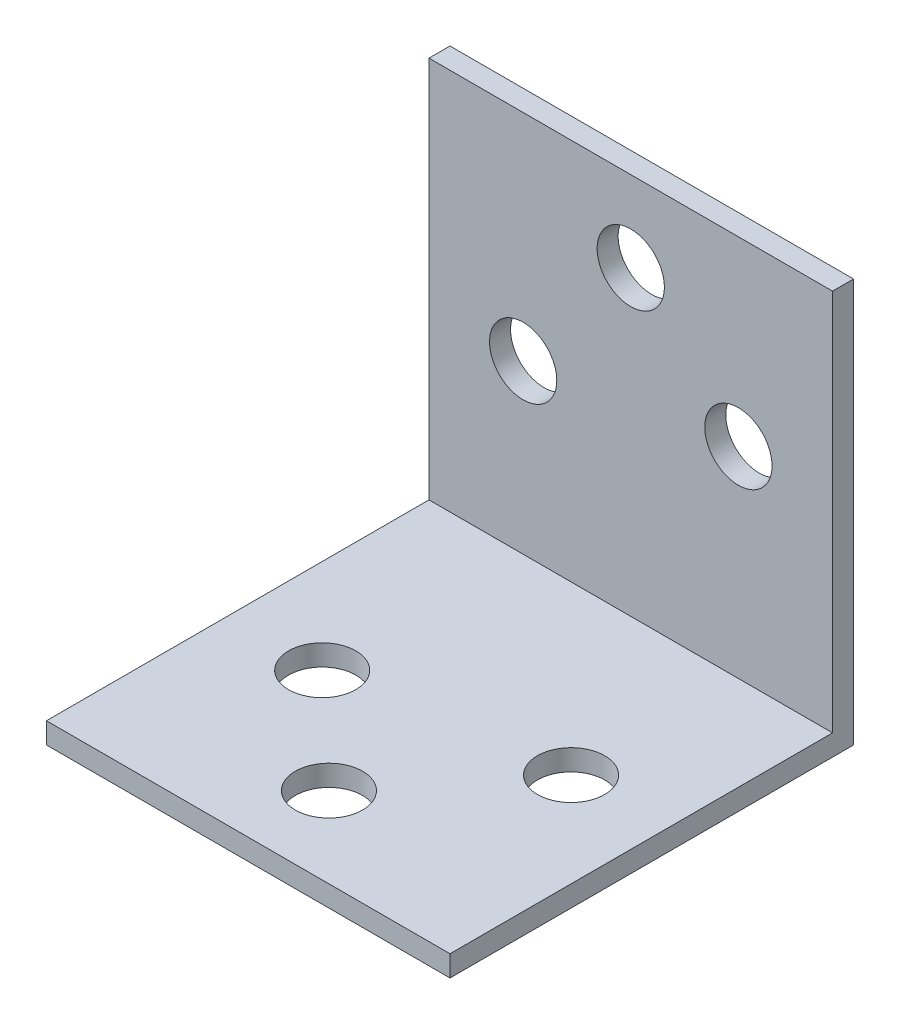
ISO-10303-21;
HEADER;
FILE_DESCRIPTION(('STEP AP214'),'2;1');
FILE_NAME('part.step','',(''),(''),'','','');
FILE_SCHEMA(('AUTOMOTIVE_DESIGN { 1 0 10303 214 1 1 1 1 }'));
ENDSEC;
DATA;
#1=APPLICATION_CONTEXT('core data for automotive mechanical design processes');
#2=APPLICATION_PROTOCOL_DEFINITION('international standard','automotive_design',2000,#1);
#3=PRODUCT_CONTEXT('',#1,'mechanical');
#4=PRODUCT('Part','Part','',(#3));
#5=PRODUCT_RELATED_PRODUCT_CATEGORY('part','',(#4));
#6=PRODUCT_DEFINITION_FORMATION('','',#4);
#7=PRODUCT_DEFINITION_CONTEXT('part definition',#1,'design');
#8=PRODUCT_DEFINITION('design','',#6,#7);
#9=PRODUCT_DEFINITION_SHAPE('','',#8);
#10=(LENGTH_UNIT() NAMED_UNIT(*) SI_UNIT(.MILLI.,.METRE.));
#11=(NAMED_UNIT(*) PLANE_ANGLE_UNIT() SI_UNIT($,.RADIAN.));
#12=(NAMED_UNIT(*) SI_UNIT($,.STERADIAN.) SOLID_ANGLE_UNIT());
#13=UNCERTAINTY_MEASURE_WITH_UNIT(LENGTH_MEASURE(1.E-05),#10,'distance_accuracy_value','');
#14=(GEOMETRIC_REPRESENTATION_CONTEXT(3) GLOBAL_UNCERTAINTY_ASSIGNED_CONTEXT((#13)) GLOBAL_UNIT_ASSIGNED_CONTEXT((#10,
#11,#12)) REPRESENTATION_CONTEXT('',''));
#15=CARTESIAN_POINT('',(0.,0.,0.));
#16=DIRECTION('',(0.,0.,1.));
#17=DIRECTION('',(1.,0.,0.));
#18=AXIS2_PLACEMENT_3D('',#15,#16,#17);
#19=CARTESIAN_POINT('',(0.,1.984375,0.));
#20=DIRECTION('',(0.,-1.,0.));
#21=DIRECTION('',(0.,0.,-1.));
#22=AXIS2_PLACEMENT_3D('',#19,#20,#21);
#23=PLANE('',#22);
#24=CARTESIAN_POINT('',(29.21,1.984375,17.78));
#25=DIRECTION('',(0.,1.,0.));
#26=DIRECTION('',(0.,0.,1.));
#27=AXIS2_PLACEMENT_3D('',#24,#25,#26);
#28=CIRCLE('',#27,3.175);
#29=CARTESIAN_POINT('',(29.21,1.984375,20.955));
#30=VERTEX_POINT('',#29);
#31=EDGE_CURVE('E169',#30,#30,#28,.T.);
#32=ORIENTED_EDGE('',*,*,#31,.F.);
#33=EDGE_LOOP('',(#32));
#34=FACE_BOUND('',#33,.T.);
#35=CARTESIAN_POINT('',(19.05,1.984375,30.48));
#36=DIRECTION('',(0.,1.,0.));
#37=DIRECTION('',(0.,0.,1.));
#38=AXIS2_PLACEMENT_3D('',#35,#36,#37);
#39=CIRCLE('',#38,3.175);
#40=CARTESIAN_POINT('',(19.05,1.984375,33.655));
#41=VERTEX_POINT('',#40);
#42=EDGE_CURVE('E177',#41,#41,#39,.T.);
#43=ORIENTED_EDGE('',*,*,#42,.F.);
#44=EDGE_LOOP('',(#43));
#45=FACE_BOUND('',#44,.T.);
#46=CARTESIAN_POINT('',(8.89,1.984375,20.955));
#47=DIRECTION('',(0.,1.,0.));
#48=DIRECTION('',(0.,0.,1.));
#49=AXIS2_PLACEMENT_3D('',#46,#47,#48);
#50=CIRCLE('',#49,3.175);
#51=CARTESIAN_POINT('',(8.89,1.984375,24.13));
#52=VERTEX_POINT('',#51);
#53=EDGE_CURVE('E117',#52,#52,#50,.T.);
#54=ORIENTED_EDGE('',*,*,#53,.F.);
#55=EDGE_LOOP('',(#54));
#56=FACE_BOUND('',#55,.T.);
#57=DIRECTION('',(1.,0.,0.));
#58=VECTOR('',#57,1.);
#59=CARTESIAN_POINT('',(38.1,1.984375,1.984375));
#60=LINE('',#59,#58);
#61=CARTESIAN_POINT('',(0.,1.984375,1.98437500000002));
#62=VERTEX_POINT('',#61);
#63=CARTESIAN_POINT('',(38.1,1.984375,1.984375));
#64=VERTEX_POINT('',#63);
#65=EDGE_CURVE('E59',#62,#64,#60,.T.);
#66=ORIENTED_EDGE('',*,*,#65,.F.);
#67=DIRECTION('',(0.,0.,1.));
#68=VECTOR('',#67,1.);
#69=CARTESIAN_POINT('',(0.,1.984375,38.1));
#70=LINE('',#69,#68);
#71=CARTESIAN_POINT('',(0.,1.984375,38.1));
#72=VERTEX_POINT('',#71);
#73=EDGE_CURVE('E99',#62,#72,#70,.T.);
#74=ORIENTED_EDGE('',*,*,#73,.T.);
#75=DIRECTION('',(1.,0.,0.));
#76=VECTOR('',#75,1.);
#77=CARTESIAN_POINT('',(38.1,1.984375,38.1));
#78=LINE('',#77,#76);
#79=CARTESIAN_POINT('',(38.1,1.984375,38.1));
#80=VERTEX_POINT('',#79);
#81=EDGE_CURVE('E65',#72,#80,#78,.T.);
#82=ORIENTED_EDGE('',*,*,#81,.T.);
#83=DIRECTION('',(0.,0.,-1.));
#84=VECTOR('',#83,1.);
#85=CARTESIAN_POINT('',(38.1,1.984375,0.));
#86=LINE('',#85,#84);
#87=EDGE_CURVE('E111',#80,#64,#86,.T.);
#88=ORIENTED_EDGE('',*,*,#87,.T.);
#89=EDGE_LOOP('',(#66,#74,#82,#88));
#90=FACE_BOUND('',#89,.T.);
#91=ADVANCED_FACE('F43',(#34,#45,#56,#90),#23,.F.);
#92=CARTESIAN_POINT('',(0.,0.,0.));
#93=DIRECTION('',(0.,-1.,0.));
#94=DIRECTION('',(0.,0.,-1.));
#95=AXIS2_PLACEMENT_3D('',#92,#93,#94);
#96=PLANE('',#95);
#97=CARTESIAN_POINT('',(19.05,0.,30.48));
#98=DIRECTION('',(0.,1.,0.));
#99=DIRECTION('',(0.,0.,1.));
#100=AXIS2_PLACEMENT_3D('',#97,#98,#99);
#101=CIRCLE('',#100,3.175);
#102=CARTESIAN_POINT('',(19.05,0.,33.655));
#103=VERTEX_POINT('',#102);
#104=EDGE_CURVE('E173',#103,#103,#101,.T.);
#105=ORIENTED_EDGE('',*,*,#104,.T.);
#106=EDGE_LOOP('',(#105));
#107=FACE_BOUND('',#106,.T.);
#108=DIRECTION('',(0.,0.,1.));
#109=VECTOR('',#108,1.);
#110=CARTESIAN_POINT('',(0.,0.,38.1));
#111=LINE('',#110,#109);
#112=CARTESIAN_POINT('',(0.,0.,0.));
#113=VERTEX_POINT('',#112);
#114=CARTESIAN_POINT('',(0.,0.,38.1));
#115=VERTEX_POINT('',#114);
#116=EDGE_CURVE('E106',#113,#115,#111,.T.);
#117=ORIENTED_EDGE('',*,*,#116,.F.);
#118=DIRECTION('',(-1.,0.,0.));
#119=VECTOR('',#118,1.);
#120=CARTESIAN_POINT('',(0.,0.,0.));
#121=LINE('',#120,#119);
#122=CARTESIAN_POINT('',(38.1,0.,0.));
#123=VERTEX_POINT('',#122);
#124=EDGE_CURVE('E85',#123,#113,#121,.T.);
#125=ORIENTED_EDGE('',*,*,#124,.F.);
#126=DIRECTION('',(0.,0.,-1.));
#127=VECTOR('',#126,1.);
#128=CARTESIAN_POINT('',(38.1,0.,0.));
#129=LINE('',#128,#127);
#130=CARTESIAN_POINT('',(38.1,0.,38.1));
#131=VERTEX_POINT('',#130);
#132=EDGE_CURVE('E100',#131,#123,#129,.T.);
#133=ORIENTED_EDGE('',*,*,#132,.F.);
#134=DIRECTION('',(1.,0.,0.));
#135=VECTOR('',#134,1.);
#136=CARTESIAN_POINT('',(38.1,0.,38.1));
#137=LINE('',#136,#135);
#138=EDGE_CURVE('E115',#115,#131,#137,.T.);
#139=ORIENTED_EDGE('',*,*,#138,.F.);
#140=EDGE_LOOP('',(#117,#125,#133,#139));
#141=FACE_BOUND('',#140,.T.);
#142=CARTESIAN_POINT('',(8.89,0.,20.955));
#143=DIRECTION('',(0.,1.,0.));
#144=DIRECTION('',(0.,0.,1.));
#145=AXIS2_PLACEMENT_3D('',#142,#143,#144);
#146=CIRCLE('',#145,3.175);
#147=CARTESIAN_POINT('',(8.89,0.,24.13));
#148=VERTEX_POINT('',#147);
#149=EDGE_CURVE('E123',#148,#148,#146,.T.);
#150=ORIENTED_EDGE('',*,*,#149,.T.);
#151=EDGE_LOOP('',(#150));
#152=FACE_BOUND('',#151,.T.);
#153=CARTESIAN_POINT('',(29.21,0.,17.78));
#154=DIRECTION('',(0.,1.,0.));
#155=DIRECTION('',(0.,0.,1.));
#156=AXIS2_PLACEMENT_3D('',#153,#154,#155);
#157=CIRCLE('',#156,3.175);
#158=CARTESIAN_POINT('',(29.21,0.,20.955));
#159=VERTEX_POINT('',#158);
#160=EDGE_CURVE('E168',#159,#159,#157,.T.);
#161=ORIENTED_EDGE('',*,*,#160,.T.);
#162=EDGE_LOOP('',(#161));
#163=FACE_BOUND('',#162,.T.);
#164=ADVANCED_FACE('F113',(#107,#141,#152,#163),#96,.T.);
#165=CARTESIAN_POINT('',(0.,1.984375,38.1));
#166=DIRECTION('',(1.,0.,0.));
#167=DIRECTION('',(0.,0.,-1.));
#168=AXIS2_PLACEMENT_3D('',#165,#166,#167);
#169=PLANE('',#168);
#170=ORIENTED_EDGE('',*,*,#116,.T.);
#171=DIRECTION('',(0.,-1.,0.));
#172=VECTOR('',#171,1.);
#173=CARTESIAN_POINT('',(0.,1.984375,38.1));
#174=LINE('',#173,#172);
#175=EDGE_CURVE('E11',#72,#115,#174,.T.);
#176=ORIENTED_EDGE('',*,*,#175,.F.);
#177=ORIENTED_EDGE('',*,*,#73,.F.);
#178=DIRECTION('',(0.,-1.,0.));
#179=VECTOR('',#178,1.);
#180=CARTESIAN_POINT('',(0.,1.984375,1.984375));
#181=LINE('',#180,#179);
#182=CARTESIAN_POINT('',(0.,38.1,1.984375));
#183=VERTEX_POINT('',#182);
#184=EDGE_CURVE('E140',#183,#62,#181,.T.);
#185=ORIENTED_EDGE('',*,*,#184,.F.);
#186=DIRECTION('',(0.,0.,-1.));
#187=VECTOR('',#186,1.);
#188=CARTESIAN_POINT('',(0.,38.1,1.984375));
#189=LINE('',#188,#187);
#190=CARTESIAN_POINT('',(0.,38.1,0.));
#191=VERTEX_POINT('',#190);
#192=EDGE_CURVE('E109',#183,#191,#189,.T.);
#193=ORIENTED_EDGE('',*,*,#192,.T.);
#194=DIRECTION('',(0.,-1.,0.));
#195=VECTOR('',#194,1.);
#196=CARTESIAN_POINT('',(0.,1.984375,0.));
#197=LINE('',#196,#195);
#198=EDGE_CURVE('E91',#191,#113,#197,.T.);
#199=ORIENTED_EDGE('',*,*,#198,.T.);
#200=EDGE_LOOP('',(#170,#176,#177,#185,#193,#199));
#201=FACE_BOUND('',#200,.T.);
#202=ADVANCED_FACE('F45',(#201),#169,.F.);
#203=CARTESIAN_POINT('',(38.1,1.984375,38.1));
#204=DIRECTION('',(0.,0.,-1.));
#205=DIRECTION('',(-1.,0.,0.));
#206=AXIS2_PLACEMENT_3D('',#203,#204,#205);
#207=PLANE('',#206);
#208=ORIENTED_EDGE('',*,*,#138,.T.);
#209=DIRECTION('',(0.,-1.,0.));
#210=VECTOR('',#209,1.);
#211=CARTESIAN_POINT('',(38.1,1.984375,38.1));
#212=LINE('',#211,#210);
#213=EDGE_CURVE('E52',#80,#131,#212,.T.);
#214=ORIENTED_EDGE('',*,*,#213,.F.);
#215=ORIENTED_EDGE('',*,*,#81,.F.);
#216=ORIENTED_EDGE('',*,*,#175,.T.);
#217=EDGE_LOOP('',(#208,#214,#215,#216));
#218=FACE_BOUND('',#217,.T.);
#219=ADVANCED_FACE('F138',(#218),#207,.F.);
#220=CARTESIAN_POINT('',(38.1,1.984375,0.));
#221=DIRECTION('',(-1.,0.,0.));
#222=DIRECTION('',(0.,0.,1.));
#223=AXIS2_PLACEMENT_3D('',#220,#221,#222);
#224=PLANE('',#223);
#225=ORIENTED_EDGE('',*,*,#132,.T.);
#226=DIRECTION('',(0.,-1.,0.));
#227=VECTOR('',#226,1.);
#228=CARTESIAN_POINT('',(38.1,1.984375,0.));
#229=LINE('',#228,#227);
#230=CARTESIAN_POINT('',(38.1,38.1,0.));
#231=VERTEX_POINT('',#230);
#232=EDGE_CURVE('E94',#231,#123,#229,.T.);
#233=ORIENTED_EDGE('',*,*,#232,.F.);
#234=DIRECTION('',(0.,0.,-1.));
#235=VECTOR('',#234,1.);
#236=CARTESIAN_POINT('',(38.1,38.1,1.984375));
#237=LINE('',#236,#235);
#238=CARTESIAN_POINT('',(38.1,38.1,1.984375));
#239=VERTEX_POINT('',#238);
#240=EDGE_CURVE('E155',#239,#231,#237,.T.);
#241=ORIENTED_EDGE('',*,*,#240,.F.);
#242=DIRECTION('',(0.,1.,0.));
#243=VECTOR('',#242,1.);
#244=CARTESIAN_POINT('',(38.1,38.1,1.984375));
#245=LINE('',#244,#243);
#246=EDGE_CURVE('E157',#64,#239,#245,.T.);
#247=ORIENTED_EDGE('',*,*,#246,.F.);
#248=ORIENTED_EDGE('',*,*,#87,.F.);
#249=ORIENTED_EDGE('',*,*,#213,.T.);
#250=EDGE_LOOP('',(#225,#233,#241,#247,#248,#249));
#251=FACE_BOUND('',#250,.T.);
#252=ADVANCED_FACE('F135',(#251),#224,.F.);
#253=CARTESIAN_POINT('',(0.,1.984375,0.));
#254=DIRECTION('',(0.,0.,1.));
#255=DIRECTION('',(1.,0.,0.));
#256=AXIS2_PLACEMENT_3D('',#253,#254,#255);
#257=PLANE('',#256);
#258=ORIENTED_EDGE('',*,*,#124,.T.);
#259=ORIENTED_EDGE('',*,*,#198,.F.);
#260=DIRECTION('',(-1.,0.,0.));
#261=VECTOR('',#260,1.);
#262=CARTESIAN_POINT('',(0.,38.1,0.));
#263=LINE('',#262,#261);
#264=EDGE_CURVE('E161',#231,#191,#263,.T.);
#265=ORIENTED_EDGE('',*,*,#264,.F.);
#266=ORIENTED_EDGE('',*,*,#232,.T.);
#267=EDGE_LOOP('',(#258,#259,#265,#266));
#268=FACE_BOUND('',#267,.T.);
#269=CARTESIAN_POINT('',(8.89,17.78,0.));
#270=DIRECTION('',(0.,0.,1.));
#271=DIRECTION('',(1.,0.,0.));
#272=AXIS2_PLACEMENT_3D('',#269,#270,#271);
#273=CIRCLE('',#272,3.175);
#274=CARTESIAN_POINT('',(12.065,17.78,0.));
#275=VERTEX_POINT('',#274);
#276=EDGE_CURVE('E203',#275,#275,#273,.T.);
#277=ORIENTED_EDGE('',*,*,#276,.T.);
#278=EDGE_LOOP('',(#277));
#279=FACE_BOUND('',#278,.T.);
#280=CARTESIAN_POINT('',(19.05,30.48,0.));
#281=DIRECTION('',(0.,0.,1.));
#282=DIRECTION('',(1.,0.,0.));
#283=AXIS2_PLACEMENT_3D('',#280,#281,#282);
#284=CIRCLE('',#283,3.175);
#285=CARTESIAN_POINT('',(22.225,30.48,0.));
#286=VERTEX_POINT('',#285);
#287=EDGE_CURVE('E195',#286,#286,#284,.T.);
#288=ORIENTED_EDGE('',*,*,#287,.T.);
#289=EDGE_LOOP('',(#288));
#290=FACE_BOUND('',#289,.T.);
#291=CARTESIAN_POINT('',(29.21,20.955,0.));
#292=DIRECTION('',(0.,0.,1.));
#293=DIRECTION('',(1.,0.,0.));
#294=AXIS2_PLACEMENT_3D('',#291,#292,#293);
#295=CIRCLE('',#294,3.175);
#296=CARTESIAN_POINT('',(32.385,20.955,0.));
#297=VERTEX_POINT('',#296);
#298=EDGE_CURVE('E211',#297,#297,#295,.T.);
#299=ORIENTED_EDGE('',*,*,#298,.T.);
#300=EDGE_LOOP('',(#299));
#301=FACE_BOUND('',#300,.T.);
#302=ADVANCED_FACE('F87',(#268,#279,#290,#301),#257,.F.);
#303=CARTESIAN_POINT('',(8.89,1.984375,20.955));
#304=DIRECTION('',(0.,-1.,0.));
#305=DIRECTION('',(0.,0.,-1.));
#306=AXIS2_PLACEMENT_3D('',#303,#304,#305);
#307=CYLINDRICAL_SURFACE('',#306,3.175);
#308=ORIENTED_EDGE('',*,*,#53,.T.);
#309=EDGE_LOOP('',(#308));
#310=FACE_BOUND('',#309,.T.);
#311=ORIENTED_EDGE('',*,*,#149,.F.);
#312=EDGE_LOOP('',(#311));
#313=FACE_BOUND('',#312,.T.);
#314=ADVANCED_FACE('F248',(#310,#313),#307,.F.);
#315=CARTESIAN_POINT('',(19.05,1.984375,30.48));
#316=DIRECTION('',(0.,-1.,0.));
#317=DIRECTION('',(0.,0.,-1.));
#318=AXIS2_PLACEMENT_3D('',#315,#316,#317);
#319=CYLINDRICAL_SURFACE('',#318,3.175);
#320=ORIENTED_EDGE('',*,*,#42,.T.);
#321=EDGE_LOOP('',(#320));
#322=FACE_BOUND('',#321,.T.);
#323=ORIENTED_EDGE('',*,*,#104,.F.);
#324=EDGE_LOOP('',(#323));
#325=FACE_BOUND('',#324,.T.);
#326=ADVANCED_FACE('F233',(#322,#325),#319,.F.);
#327=CARTESIAN_POINT('',(29.21,1.984375,17.78));
#328=DIRECTION('',(0.,-1.,0.));
#329=DIRECTION('',(0.,0.,-1.));
#330=AXIS2_PLACEMENT_3D('',#327,#328,#329);
#331=CYLINDRICAL_SURFACE('',#330,3.175);
#332=ORIENTED_EDGE('',*,*,#31,.T.);
#333=EDGE_LOOP('',(#332));
#334=FACE_BOUND('',#333,.T.);
#335=ORIENTED_EDGE('',*,*,#160,.F.);
#336=EDGE_LOOP('',(#335));
#337=FACE_BOUND('',#336,.T.);
#338=ADVANCED_FACE('F224',(#334,#337),#331,.F.);
#339=CARTESIAN_POINT('',(0.,0.,1.984375));
#340=DIRECTION('',(0.,0.,-1.));
#341=DIRECTION('',(-1.,0.,0.));
#342=AXIS2_PLACEMENT_3D('',#339,#340,#341);
#343=PLANE('',#342);
#344=ORIENTED_EDGE('',*,*,#65,.T.);
#345=ORIENTED_EDGE('',*,*,#246,.T.);
#346=DIRECTION('',(-1.,0.,0.));
#347=VECTOR('',#346,1.);
#348=CARTESIAN_POINT('',(0.,38.1,1.984375));
#349=LINE('',#348,#347);
#350=EDGE_CURVE('E150',#239,#183,#349,.T.);
#351=ORIENTED_EDGE('',*,*,#350,.T.);
#352=ORIENTED_EDGE('',*,*,#184,.T.);
#353=EDGE_LOOP('',(#344,#345,#351,#352));
#354=FACE_BOUND('',#353,.T.);
#355=CARTESIAN_POINT('',(19.05,30.48,1.984375));
#356=DIRECTION('',(0.,0.,1.));
#357=DIRECTION('',(1.,0.,0.));
#358=AXIS2_PLACEMENT_3D('',#355,#356,#357);
#359=CIRCLE('',#358,3.175);
#360=CARTESIAN_POINT('',(22.225,30.48,1.984375));
#361=VERTEX_POINT('',#360);
#362=EDGE_CURVE('E163',#361,#361,#359,.T.);
#363=ORIENTED_EDGE('',*,*,#362,.F.);
#364=EDGE_LOOP('',(#363));
#365=FACE_BOUND('',#364,.T.);
#366=CARTESIAN_POINT('',(8.89,17.78,1.984375));
#367=DIRECTION('',(0.,0.,1.));
#368=DIRECTION('',(1.,0.,0.));
#369=AXIS2_PLACEMENT_3D('',#366,#367,#368);
#370=CIRCLE('',#369,3.175);
#371=CARTESIAN_POINT('',(12.065,17.78,1.984375));
#372=VERTEX_POINT('',#371);
#373=EDGE_CURVE('E199',#372,#372,#370,.T.);
#374=ORIENTED_EDGE('',*,*,#373,.F.);
#375=EDGE_LOOP('',(#374));
#376=FACE_BOUND('',#375,.T.);
#377=CARTESIAN_POINT('',(29.21,20.955,1.984375));
#378=DIRECTION('',(0.,0.,1.));
#379=DIRECTION('',(1.,0.,0.));
#380=AXIS2_PLACEMENT_3D('',#377,#378,#379);
#381=CIRCLE('',#380,3.175);
#382=CARTESIAN_POINT('',(32.385,20.955,1.984375));
#383=VERTEX_POINT('',#382);
#384=EDGE_CURVE('E207',#383,#383,#381,.T.);
#385=ORIENTED_EDGE('',*,*,#384,.F.);
#386=EDGE_LOOP('',(#385));
#387=FACE_BOUND('',#386,.T.);
#388=ADVANCED_FACE('F145',(#354,#365,#376,#387),#343,.F.);
#389=CARTESIAN_POINT('',(0.,38.1,1.984375));
#390=DIRECTION('',(0.,-1.,0.));
#391=DIRECTION('',(0.,0.,-1.));
#392=AXIS2_PLACEMENT_3D('',#389,#390,#391);
#393=PLANE('',#392);
#394=ORIENTED_EDGE('',*,*,#264,.T.);
#395=ORIENTED_EDGE('',*,*,#192,.F.);
#396=ORIENTED_EDGE('',*,*,#350,.F.);
#397=ORIENTED_EDGE('',*,*,#240,.T.);
#398=EDGE_LOOP('',(#394,#395,#396,#397));
#399=FACE_BOUND('',#398,.T.);
#400=ADVANCED_FACE('F223',(#399),#393,.F.);
#401=CARTESIAN_POINT('',(19.05,30.48,1.984375));
#402=DIRECTION('',(0.,0.,-1.));
#403=DIRECTION('',(-1.,0.,0.));
#404=AXIS2_PLACEMENT_3D('',#401,#402,#403);
#405=CYLINDRICAL_SURFACE('',#404,3.175);
#406=ORIENTED_EDGE('',*,*,#362,.T.);
#407=EDGE_LOOP('',(#406));
#408=FACE_BOUND('',#407,.T.);
#409=ORIENTED_EDGE('',*,*,#287,.F.);
#410=EDGE_LOOP('',(#409));
#411=FACE_BOUND('',#410,.T.);
#412=ADVANCED_FACE('F230',(#408,#411),#405,.F.);
#413=CARTESIAN_POINT('',(8.89,17.78,1.984375));
#414=DIRECTION('',(0.,0.,-1.));
#415=DIRECTION('',(-1.,0.,0.));
#416=AXIS2_PLACEMENT_3D('',#413,#414,#415);
#417=CYLINDRICAL_SURFACE('',#416,3.175);
#418=ORIENTED_EDGE('',*,*,#373,.T.);
#419=EDGE_LOOP('',(#418));
#420=FACE_BOUND('',#419,.T.);
#421=ORIENTED_EDGE('',*,*,#276,.F.);
#422=EDGE_LOOP('',(#421));
#423=FACE_BOUND('',#422,.T.);
#424=ADVANCED_FACE('F327',(#420,#423),#417,.F.);
#425=CARTESIAN_POINT('',(29.21,20.955,1.984375));
#426=DIRECTION('',(0.,0.,-1.));
#427=DIRECTION('',(-1.,0.,0.));
#428=AXIS2_PLACEMENT_3D('',#425,#426,#427);
#429=CYLINDRICAL_SURFACE('',#428,3.175);
#430=ORIENTED_EDGE('',*,*,#384,.T.);
#431=EDGE_LOOP('',(#430));
#432=FACE_BOUND('',#431,.T.);
#433=ORIENTED_EDGE('',*,*,#298,.F.);
#434=EDGE_LOOP('',(#433));
#435=FACE_BOUND('',#434,.T.);
#436=ADVANCED_FACE('F219',(#432,#435),#429,.F.);
#437=CLOSED_SHELL('',(#91,#164,#202,#219,#252,#302,#314,#326,#338,#388,#400,#412,#424,#436));
#438=MANIFOLD_SOLID_BREP('B2',#437);
#439=ADVANCED_BREP_SHAPE_REPRESENTATION('',(#18,#438),#14);
#440=SHAPE_DEFINITION_REPRESENTATION(#9,#439);
ENDSEC;
END-ISO-10303-21;
